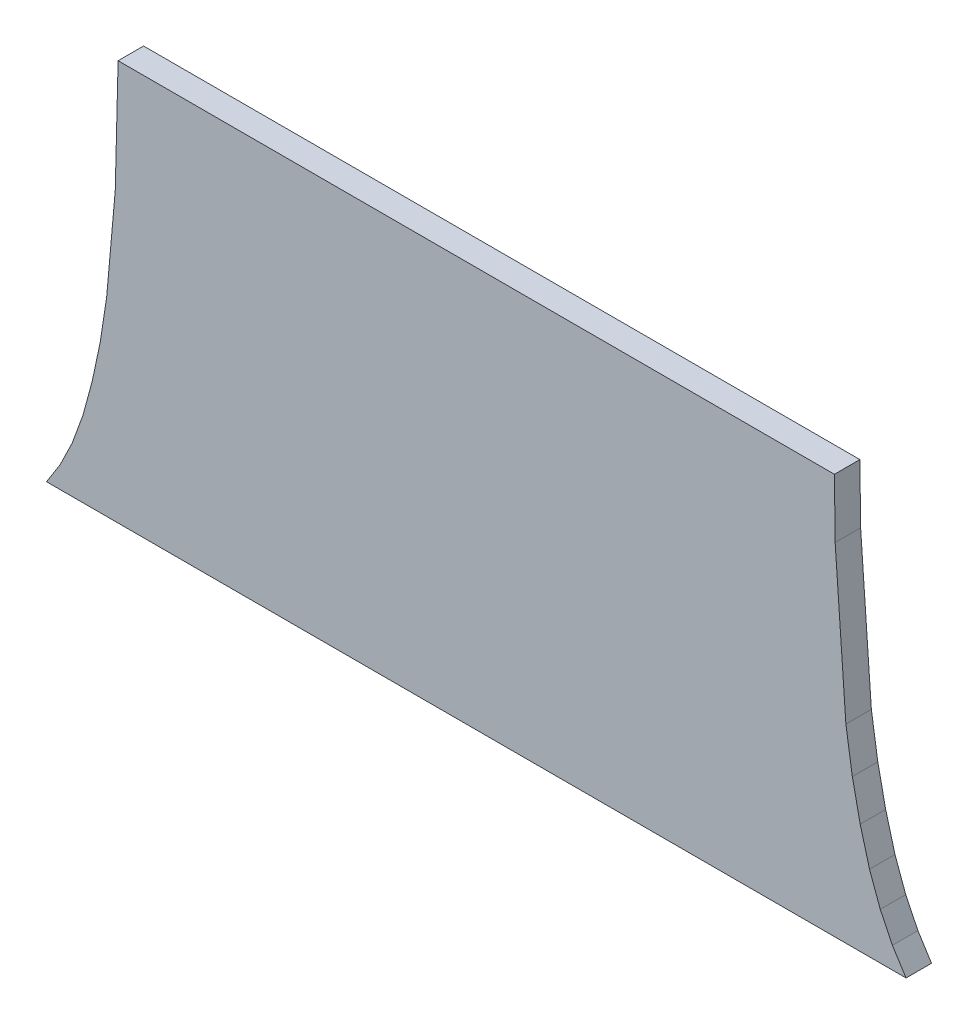
ISO-10303-21;
HEADER;
FILE_DESCRIPTION(('STEP AP214'),'2;1');
FILE_NAME('part.step','',(''),(''),'','','');
FILE_SCHEMA(('AUTOMOTIVE_DESIGN { 1 0 10303 214 1 1 1 1 }'));
ENDSEC;
DATA;
#1=APPLICATION_CONTEXT('core data for automotive mechanical design processes');
#2=APPLICATION_PROTOCOL_DEFINITION('international standard','automotive_design',2000,#1);
#3=PRODUCT_CONTEXT('',#1,'mechanical');
#4=PRODUCT('Part','Part','',(#3));
#5=PRODUCT_RELATED_PRODUCT_CATEGORY('part','',(#4));
#6=PRODUCT_DEFINITION_FORMATION('','',#4);
#7=PRODUCT_DEFINITION_CONTEXT('part definition',#1,'design');
#8=PRODUCT_DEFINITION('design','',#6,#7);
#9=PRODUCT_DEFINITION_SHAPE('','',#8);
#10=(LENGTH_UNIT() NAMED_UNIT(*) SI_UNIT(.MILLI.,.METRE.));
#11=(NAMED_UNIT(*) PLANE_ANGLE_UNIT() SI_UNIT($,.RADIAN.));
#12=(NAMED_UNIT(*) SI_UNIT($,.STERADIAN.) SOLID_ANGLE_UNIT());
#13=UNCERTAINTY_MEASURE_WITH_UNIT(LENGTH_MEASURE(1.E-05),#10,'distance_accuracy_value','');
#14=(GEOMETRIC_REPRESENTATION_CONTEXT(3) GLOBAL_UNCERTAINTY_ASSIGNED_CONTEXT((#13)) GLOBAL_UNIT_ASSIGNED_CONTEXT((#10,
#11,#12)) REPRESENTATION_CONTEXT('',''));
#15=CARTESIAN_POINT('',(0.,0.,0.));
#16=DIRECTION('',(0.,0.,1.));
#17=DIRECTION('',(1.,0.,0.));
#18=AXIS2_PLACEMENT_3D('',#15,#16,#17);
#19=CARTESIAN_POINT('',(88.4000015258789,39.4690017700195,0.));
#20=DIRECTION('',(0.,-1.,0.));
#21=DIRECTION('',(-1.,0.,0.));
#22=AXIS2_PLACEMENT_3D('',#19,#20,#21);
#23=PLANE('',#22);
#24=DIRECTION('',(-1.,0.,0.));
#25=VECTOR('',#24,1.);
#26=CARTESIAN_POINT('',(88.4000015258789,39.4690017700195,0.03556));
#27=LINE('',#26,#25);
#28=CARTESIAN_POINT('',(88.4000015258789,39.4690017700195,0.03556));
#29=VERTEX_POINT('',#28);
#30=CARTESIAN_POINT('',(87.4000015258789,39.4690017700195,0.03556));
#31=VERTEX_POINT('',#30);
#32=EDGE_CURVE('E11',#29,#31,#27,.T.);
#33=ORIENTED_EDGE('',*,*,#32,.F.);
#34=DIRECTION('',(0.,0.,1.));
#35=VECTOR('',#34,1.);
#36=CARTESIAN_POINT('',(88.4000015258789,39.4690017700195,0.));
#37=LINE('',#36,#35);
#38=CARTESIAN_POINT('',(88.4000015258789,39.4690017700195,0.));
#39=VERTEX_POINT('',#38);
#40=EDGE_CURVE('E24',#39,#29,#37,.T.);
#41=ORIENTED_EDGE('',*,*,#40,.F.);
#42=DIRECTION('',(-1.,0.,0.));
#43=VECTOR('',#42,1.);
#44=CARTESIAN_POINT('',(88.4000015258789,39.4690017700195,0.));
#45=LINE('',#44,#43);
#46=CARTESIAN_POINT('',(87.4000015258789,39.4690017700195,0.));
#47=VERTEX_POINT('',#46);
#48=EDGE_CURVE('E311',#39,#47,#45,.T.);
#49=ORIENTED_EDGE('',*,*,#48,.T.);
#50=DIRECTION('',(0.,0.,1.));
#51=VECTOR('',#50,1.);
#52=CARTESIAN_POINT('',(87.4000015258789,39.4690017700195,0.));
#53=LINE('',#52,#51);
#54=EDGE_CURVE('E37',#47,#31,#53,.T.);
#55=ORIENTED_EDGE('',*,*,#54,.T.);
#56=EDGE_LOOP('',(#33,#41,#49,#55));
#57=FACE_BOUND('',#56,.T.);
#58=ADVANCED_FACE('F17',(#57),#23,.F.);
#59=CARTESIAN_POINT('',(88.4010009765625,39.3870010375977,0.));
#60=DIRECTION('',(-0.999925730774336,-0.012187408888299,0.));
#61=DIRECTION('',(-0.012187408888299,0.999925730774336,0.));
#62=AXIS2_PLACEMENT_3D('',#59,#60,#61);
#63=PLANE('',#62);
#64=DIRECTION('',(-0.012187408888299,0.999925730774336,0.));
#65=VECTOR('',#64,1.);
#66=CARTESIAN_POINT('',(88.4010009765625,39.3870010375977,0.03556));
#67=LINE('',#66,#65);
#68=CARTESIAN_POINT('',(88.4010009765625,39.3870010375977,0.03556));
#69=VERTEX_POINT('',#68);
#70=EDGE_CURVE('E307',#69,#29,#67,.T.);
#71=ORIENTED_EDGE('',*,*,#70,.F.);
#72=DIRECTION('',(0.,0.,1.));
#73=VECTOR('',#72,1.);
#74=CARTESIAN_POINT('',(88.4010009765625,39.3870010375977,0.));
#75=LINE('',#74,#73);
#76=CARTESIAN_POINT('',(88.4010009765625,39.3870010375977,0.));
#77=VERTEX_POINT('',#76);
#78=EDGE_CURVE('E305',#77,#69,#75,.T.);
#79=ORIENTED_EDGE('',*,*,#78,.F.);
#80=DIRECTION('',(-0.012187408888299,0.999925730774336,0.));
#81=VECTOR('',#80,1.);
#82=CARTESIAN_POINT('',(88.4010009765625,39.3870010375977,0.));
#83=LINE('',#82,#81);
#84=EDGE_CURVE('E303',#77,#39,#83,.T.);
#85=ORIENTED_EDGE('',*,*,#84,.T.);
#86=ORIENTED_EDGE('',*,*,#40,.T.);
#87=EDGE_LOOP('',(#71,#79,#85,#86));
#88=FACE_BOUND('',#87,.T.);
#89=ADVANCED_FACE('F314',(#88),#63,.F.);
#90=CARTESIAN_POINT('',(88.416000366211,39.1749992370605,0.));
#91=DIRECTION('',(-0.997506488728673,-0.0705748180599396,0.));
#92=DIRECTION('',(-0.0705748180599396,0.997506488728673,0.));
#93=AXIS2_PLACEMENT_3D('',#90,#91,#92);
#94=PLANE('',#93);
#95=DIRECTION('',(-0.0705748180599396,0.997506488728673,0.));
#96=VECTOR('',#95,1.);
#97=CARTESIAN_POINT('',(88.4160003662109,39.1749992370605,0.03556));
#98=LINE('',#97,#96);
#99=CARTESIAN_POINT('',(88.4160003662109,39.1749992370605,0.03556));
#100=VERTEX_POINT('',#99);
#101=EDGE_CURVE('E300',#100,#69,#98,.T.);
#102=ORIENTED_EDGE('',*,*,#101,.F.);
#103=DIRECTION('',(0.,0.,1.));
#104=VECTOR('',#103,1.);
#105=CARTESIAN_POINT('',(88.4160003662109,39.1749992370605,0.));
#106=LINE('',#105,#104);
#107=CARTESIAN_POINT('',(88.4160003662109,39.1749992370605,0.));
#108=VERTEX_POINT('',#107);
#109=EDGE_CURVE('E298',#108,#100,#106,.T.);
#110=ORIENTED_EDGE('',*,*,#109,.F.);
#111=DIRECTION('',(-0.0705748180599396,0.997506488728673,0.));
#112=VECTOR('',#111,1.);
#113=CARTESIAN_POINT('',(88.4160003662109,39.1749992370605,0.));
#114=LINE('',#113,#112);
#115=EDGE_CURVE('E295',#108,#77,#114,.T.);
#116=ORIENTED_EDGE('',*,*,#115,.T.);
#117=ORIENTED_EDGE('',*,*,#78,.T.);
#118=EDGE_LOOP('',(#102,#110,#116,#117));
#119=FACE_BOUND('',#118,.T.);
#120=ADVANCED_FACE('F317',(#119),#94,.F.);
#121=CARTESIAN_POINT('',(88.4250030517578,39.1160011291504,0.));
#122=DIRECTION('',(-0.98855716875994,-0.150846690694003,0.));
#123=DIRECTION('',(-0.150846690694003,0.98855716875994,0.));
#124=AXIS2_PLACEMENT_3D('',#121,#122,#123);
#125=PLANE('',#124);
#126=DIRECTION('',(-0.150846690694003,0.98855716875994,0.));
#127=VECTOR('',#126,1.);
#128=CARTESIAN_POINT('',(88.4250030517578,39.1160011291504,0.03556));
#129=LINE('',#128,#127);
#130=CARTESIAN_POINT('',(88.4250030517578,39.1160011291504,0.03556));
#131=VERTEX_POINT('',#130);
#132=EDGE_CURVE('E292',#131,#100,#129,.T.);
#133=ORIENTED_EDGE('',*,*,#132,.F.);
#134=DIRECTION('',(0.,0.,1.));
#135=VECTOR('',#134,1.);
#136=CARTESIAN_POINT('',(88.4250030517578,39.1160011291504,0.));
#137=LINE('',#136,#135);
#138=CARTESIAN_POINT('',(88.4250030517578,39.1160011291504,0.));
#139=VERTEX_POINT('',#138);
#140=EDGE_CURVE('E290',#139,#131,#137,.T.);
#141=ORIENTED_EDGE('',*,*,#140,.F.);
#142=DIRECTION('',(-0.150846690694003,0.98855716875994,0.));
#143=VECTOR('',#142,1.);
#144=CARTESIAN_POINT('',(88.4250030517578,39.1160011291504,0.));
#145=LINE('',#144,#143);
#146=EDGE_CURVE('E287',#139,#108,#145,.T.);
#147=ORIENTED_EDGE('',*,*,#146,.T.);
#148=ORIENTED_EDGE('',*,*,#109,.T.);
#149=EDGE_LOOP('',(#133,#141,#147,#148));
#150=FACE_BOUND('',#149,.T.);
#151=ADVANCED_FACE('F322',(#150),#125,.F.);
#152=CARTESIAN_POINT('',(88.4359970092774,39.0639991760254,0.));
#153=DIRECTION('',(-0.978374288693552,-0.206842334214702,0.));
#154=DIRECTION('',(-0.206842334214702,0.978374288693552,0.));
#155=AXIS2_PLACEMENT_3D('',#152,#153,#154);
#156=PLANE('',#155);
#157=DIRECTION('',(-0.206842334214702,0.978374288693552,0.));
#158=VECTOR('',#157,1.);
#159=CARTESIAN_POINT('',(88.4359970092774,39.0639991760254,0.03556));
#160=LINE('',#159,#158);
#161=CARTESIAN_POINT('',(88.4359970092774,39.0639991760254,0.03556));
#162=VERTEX_POINT('',#161);
#163=EDGE_CURVE('E284',#162,#131,#160,.T.);
#164=ORIENTED_EDGE('',*,*,#163,.F.);
#165=DIRECTION('',(0.,0.,1.));
#166=VECTOR('',#165,1.);
#167=CARTESIAN_POINT('',(88.4359970092774,39.0639991760254,0.));
#168=LINE('',#167,#166);
#169=CARTESIAN_POINT('',(88.4359970092774,39.0639991760254,0.));
#170=VERTEX_POINT('',#169);
#171=EDGE_CURVE('E282',#170,#162,#168,.T.);
#172=ORIENTED_EDGE('',*,*,#171,.F.);
#173=DIRECTION('',(-0.206842334214702,0.978374288693552,0.));
#174=VECTOR('',#173,1.);
#175=CARTESIAN_POINT('',(88.4359970092774,39.0639991760254,0.));
#176=LINE('',#175,#174);
#177=EDGE_CURVE('E279',#170,#139,#176,.T.);
#178=ORIENTED_EDGE('',*,*,#177,.T.);
#179=ORIENTED_EDGE('',*,*,#140,.T.);
#180=EDGE_LOOP('',(#164,#172,#178,#179));
#181=FACE_BOUND('',#180,.T.);
#182=ADVANCED_FACE('F325',(#181),#156,.F.);
#183=CARTESIAN_POINT('',(88.4489974975586,39.015998840332,0.));
#184=DIRECTION('',(-0.965224355692604,-0.26142292014626,0.));
#185=DIRECTION('',(-0.26142292014626,0.965224355692604,0.));
#186=AXIS2_PLACEMENT_3D('',#183,#184,#185);
#187=PLANE('',#186);
#188=DIRECTION('',(-0.26142292014626,0.965224355692604,0.));
#189=VECTOR('',#188,1.);
#190=CARTESIAN_POINT('',(88.4489974975586,39.015998840332,0.03556));
#191=LINE('',#190,#189);
#192=CARTESIAN_POINT('',(88.4489974975586,39.015998840332,0.03556));
#193=VERTEX_POINT('',#192);
#194=EDGE_CURVE('E276',#193,#162,#191,.T.);
#195=ORIENTED_EDGE('',*,*,#194,.F.);
#196=DIRECTION('',(0.,0.,1.));
#197=VECTOR('',#196,1.);
#198=CARTESIAN_POINT('',(88.4489974975586,39.015998840332,0.));
#199=LINE('',#198,#197);
#200=CARTESIAN_POINT('',(88.4489974975586,39.015998840332,0.));
#201=VERTEX_POINT('',#200);
#202=EDGE_CURVE('E274',#201,#193,#199,.T.);
#203=ORIENTED_EDGE('',*,*,#202,.F.);
#204=DIRECTION('',(-0.26142292014626,0.965224355692604,0.));
#205=VECTOR('',#204,1.);
#206=CARTESIAN_POINT('',(88.4489974975586,39.015998840332,0.));
#207=LINE('',#206,#205);
#208=EDGE_CURVE('E271',#201,#170,#207,.T.);
#209=ORIENTED_EDGE('',*,*,#208,.T.);
#210=ORIENTED_EDGE('',*,*,#171,.T.);
#211=EDGE_LOOP('',(#195,#203,#209,#210));
#212=FACE_BOUND('',#211,.T.);
#213=ADVANCED_FACE('F330',(#212),#187,.F.);
#214=CARTESIAN_POINT('',(88.463996887207,38.9749984741211,0.));
#215=DIRECTION('',(-0.939128353177272,-0.343566494668128,0.));
#216=DIRECTION('',(-0.343566494668128,0.939128353177272,0.));
#217=AXIS2_PLACEMENT_3D('',#214,#215,#216);
#218=PLANE('',#217);
#219=DIRECTION('',(-0.343566494668128,0.939128353177272,0.));
#220=VECTOR('',#219,1.);
#221=CARTESIAN_POINT('',(88.463996887207,38.9749984741211,0.03556));
#222=LINE('',#221,#220);
#223=CARTESIAN_POINT('',(88.463996887207,38.9749984741211,0.03556));
#224=VERTEX_POINT('',#223);
#225=EDGE_CURVE('E268',#224,#193,#222,.T.);
#226=ORIENTED_EDGE('',*,*,#225,.F.);
#227=DIRECTION('',(0.,0.,1.));
#228=VECTOR('',#227,1.);
#229=CARTESIAN_POINT('',(88.463996887207,38.9749984741211,0.));
#230=LINE('',#229,#228);
#231=CARTESIAN_POINT('',(88.463996887207,38.9749984741211,0.));
#232=VERTEX_POINT('',#231);
#233=EDGE_CURVE('E266',#232,#224,#230,.T.);
#234=ORIENTED_EDGE('',*,*,#233,.F.);
#235=DIRECTION('',(-0.343566494668128,0.939128353177272,0.));
#236=VECTOR('',#235,1.);
#237=CARTESIAN_POINT('',(88.463996887207,38.9749984741211,0.));
#238=LINE('',#237,#236);
#239=EDGE_CURVE('E263',#232,#201,#238,.T.);
#240=ORIENTED_EDGE('',*,*,#239,.T.);
#241=ORIENTED_EDGE('',*,*,#202,.T.);
#242=EDGE_LOOP('',(#226,#234,#240,#241));
#243=FACE_BOUND('',#242,.T.);
#244=ADVANCED_FACE('F333',(#243),#218,.F.);
#245=CARTESIAN_POINT('',(88.4810028076172,38.939998626709,0.));
#246=DIRECTION('',(-0.899447608111395,-0.437028603483444,0.));
#247=DIRECTION('',(-0.437028603483444,0.899447608111395,0.));
#248=AXIS2_PLACEMENT_3D('',#245,#246,#247);
#249=PLANE('',#248);
#250=DIRECTION('',(-0.437028603483444,0.899447608111395,0.));
#251=VECTOR('',#250,1.);
#252=CARTESIAN_POINT('',(88.4810028076172,38.939998626709,0.03556));
#253=LINE('',#252,#251);
#254=CARTESIAN_POINT('',(88.4810028076172,38.939998626709,0.03556));
#255=VERTEX_POINT('',#254);
#256=EDGE_CURVE('E260',#255,#224,#253,.T.);
#257=ORIENTED_EDGE('',*,*,#256,.F.);
#258=DIRECTION('',(0.,0.,1.));
#259=VECTOR('',#258,1.);
#260=CARTESIAN_POINT('',(88.4810028076172,38.939998626709,0.));
#261=LINE('',#260,#259);
#262=CARTESIAN_POINT('',(88.4810028076172,38.939998626709,0.));
#263=VERTEX_POINT('',#262);
#264=EDGE_CURVE('E258',#263,#255,#261,.T.);
#265=ORIENTED_EDGE('',*,*,#264,.F.);
#266=DIRECTION('',(-0.437028603483444,0.899447608111395,0.));
#267=VECTOR('',#266,1.);
#268=CARTESIAN_POINT('',(88.4810028076172,38.939998626709,0.));
#269=LINE('',#268,#267);
#270=EDGE_CURVE('E255',#263,#232,#269,.T.);
#271=ORIENTED_EDGE('',*,*,#270,.T.);
#272=ORIENTED_EDGE('',*,*,#233,.T.);
#273=EDGE_LOOP('',(#257,#265,#271,#272));
#274=FACE_BOUND('',#273,.T.);
#275=ADVANCED_FACE('F338',(#274),#249,.F.);
#276=CARTESIAN_POINT('',(88.5,38.9099998474121,0.));
#277=DIRECTION('',(-0.844844974102474,-0.535011186550142,0.));
#278=DIRECTION('',(-0.535011186550142,0.844844974102474,0.));
#279=AXIS2_PLACEMENT_3D('',#276,#277,#278);
#280=PLANE('',#279);
#281=DIRECTION('',(-0.535011186550142,0.844844974102474,0.));
#282=VECTOR('',#281,1.);
#283=CARTESIAN_POINT('',(88.5,38.9099998474121,0.03556));
#284=LINE('',#283,#282);
#285=CARTESIAN_POINT('',(88.5,38.9099998474121,0.03556));
#286=VERTEX_POINT('',#285);
#287=EDGE_CURVE('E252',#286,#255,#284,.T.);
#288=ORIENTED_EDGE('',*,*,#287,.F.);
#289=DIRECTION('',(0.,0.,1.));
#290=VECTOR('',#289,1.);
#291=CARTESIAN_POINT('',(88.5,38.9099998474121,0.));
#292=LINE('',#291,#290);
#293=CARTESIAN_POINT('',(88.5,38.9099998474121,0.));
#294=VERTEX_POINT('',#293);
#295=EDGE_CURVE('E250',#294,#286,#292,.T.);
#296=ORIENTED_EDGE('',*,*,#295,.F.);
#297=DIRECTION('',(-0.535011186550142,0.844844974102474,0.));
#298=VECTOR('',#297,1.);
#299=CARTESIAN_POINT('',(88.5,38.9099998474121,0.));
#300=LINE('',#299,#298);
#301=EDGE_CURVE('E247',#294,#263,#300,.T.);
#302=ORIENTED_EDGE('',*,*,#301,.T.);
#303=ORIENTED_EDGE('',*,*,#264,.T.);
#304=EDGE_LOOP('',(#288,#296,#302,#303));
#305=FACE_BOUND('',#304,.T.);
#306=ADVANCED_FACE('F341',(#305),#280,.F.);
#307=CARTESIAN_POINT('',(87.9041210945304,38.9099998474121,0.));
#308=DIRECTION('',(0.,1.,0.));
#309=DIRECTION('',(1.,0.,0.));
#310=AXIS2_PLACEMENT_3D('',#307,#308,#309);
#311=PLANE('',#310);
#312=DIRECTION('',(1.,0.,0.));
#313=VECTOR('',#312,1.);
#314=CARTESIAN_POINT('',(87.3000030517578,38.9099998474121,0.03556));
#315=LINE('',#314,#313);
#316=CARTESIAN_POINT('',(87.9041210945304,38.9099998474121,0.03556));
#317=VERTEX_POINT('',#316);
#318=EDGE_CURVE('E244',#317,#286,#315,.T.);
#319=ORIENTED_EDGE('',*,*,#318,.F.);
#320=DIRECTION('',(0.,0.,1.));
#321=VECTOR('',#320,1.);
#322=CARTESIAN_POINT('',(87.9041210945304,38.9099998474121,0.));
#323=LINE('',#322,#321);
#324=CARTESIAN_POINT('',(87.9041210945304,38.9099998474121,0.));
#325=VERTEX_POINT('',#324);
#326=EDGE_CURVE('E242',#325,#317,#323,.T.);
#327=ORIENTED_EDGE('',*,*,#326,.F.);
#328=DIRECTION('',(1.,0.,0.));
#329=VECTOR('',#328,1.);
#330=CARTESIAN_POINT('',(87.3000030517578,38.9099998474121,0.));
#331=LINE('',#330,#329);
#332=EDGE_CURVE('E239',#325,#294,#331,.T.);
#333=ORIENTED_EDGE('',*,*,#332,.T.);
#334=ORIENTED_EDGE('',*,*,#295,.T.);
#335=EDGE_LOOP('',(#319,#327,#333,#334));
#336=FACE_BOUND('',#335,.T.);
#337=ADVANCED_FACE('F346',(#336),#311,.F.);
#338=CARTESIAN_POINT('',(87.900002,38.4600196,0.));
#339=DIRECTION('',(0.,0.,-1.));
#340=DIRECTION('',(1.,0.,0.));
#341=AXIS2_PLACEMENT_3D('',#338,#339,#340);
#342=CYLINDRICAL_SURFACE('',#341,0.4499991);
#343=ORIENTED_EDGE('',*,*,#326,.T.);
#344=CARTESIAN_POINT('',(87.900002,38.4600196,0.03556));
#345=DIRECTION('',(0.,0.,1.));
#346=DIRECTION('',(1.,0.,0.));
#347=AXIS2_PLACEMENT_3D('',#344,#345,#346);
#348=CIRCLE('',#347,0.4499991);
#349=CARTESIAN_POINT('',(87.8958829054695,38.9099998474121,0.03556));
#350=VERTEX_POINT('',#349);
#351=EDGE_CURVE('E236',#317,#350,#348,.T.);
#352=ORIENTED_EDGE('',*,*,#351,.T.);
#353=DIRECTION('',(0.,0.,1.));
#354=VECTOR('',#353,1.);
#355=CARTESIAN_POINT('',(87.8958829054695,38.9099998474121,0.));
#356=LINE('',#355,#354);
#357=CARTESIAN_POINT('',(87.8958829054695,38.9099998474121,0.));
#358=VERTEX_POINT('',#357);
#359=EDGE_CURVE('E234',#358,#350,#356,.T.);
#360=ORIENTED_EDGE('',*,*,#359,.F.);
#361=CARTESIAN_POINT('',(87.900002,38.4600196,0.));
#362=DIRECTION('',(0.,0.,1.));
#363=DIRECTION('',(1.,0.,0.));
#364=AXIS2_PLACEMENT_3D('',#361,#362,#363);
#365=CIRCLE('',#364,0.4499991);
#366=EDGE_CURVE('E231',#325,#358,#365,.T.);
#367=ORIENTED_EDGE('',*,*,#366,.F.);
#368=EDGE_LOOP('',(#343,#352,#360,#367));
#369=FACE_BOUND('',#368,.T.);
#370=ADVANCED_FACE('F349',(#369),#342,.F.);
#371=CARTESIAN_POINT('',(87.3000030517578,38.9099998474121,0.));
#372=DIRECTION('',(0.,1.,0.));
#373=DIRECTION('',(1.,0.,0.));
#374=AXIS2_PLACEMENT_3D('',#371,#372,#373);
#375=PLANE('',#374);
#376=DIRECTION('',(1.,0.,0.));
#377=VECTOR('',#376,1.);
#378=CARTESIAN_POINT('',(87.3000030517578,38.9099998474121,0.03556));
#379=LINE('',#378,#377);
#380=CARTESIAN_POINT('',(87.3000030517578,38.9099998474121,0.03556));
#381=VERTEX_POINT('',#380);
#382=EDGE_CURVE('E228',#381,#350,#379,.T.);
#383=ORIENTED_EDGE('',*,*,#382,.F.);
#384=DIRECTION('',(0.,0.,1.));
#385=VECTOR('',#384,1.);
#386=CARTESIAN_POINT('',(87.3000030517578,38.9099998474121,0.));
#387=LINE('',#386,#385);
#388=CARTESIAN_POINT('',(87.3000030517578,38.9099998474121,0.));
#389=VERTEX_POINT('',#388);
#390=EDGE_CURVE('E226',#389,#381,#387,.T.);
#391=ORIENTED_EDGE('',*,*,#390,.F.);
#392=EDGE_CURVE('E225',#389,#358,#331,.T.);
#393=ORIENTED_EDGE('',*,*,#392,.T.);
#394=ORIENTED_EDGE('',*,*,#359,.T.);
#395=EDGE_LOOP('',(#383,#391,#393,#394));
#396=FACE_BOUND('',#395,.T.);
#397=ADVANCED_FACE('F355',(#396),#375,.F.);
#398=CARTESIAN_POINT('',(87.3190002441406,38.939998626709,0.));
#399=DIRECTION('',(0.844844974102474,-0.535011186550142,0.));
#400=DIRECTION('',(-0.535011186550142,-0.844844974102474,0.));
#401=AXIS2_PLACEMENT_3D('',#398,#399,#400);
#402=PLANE('',#401);
#403=DIRECTION('',(-0.535011186550142,-0.844844974102474,0.));
#404=VECTOR('',#403,1.);
#405=CARTESIAN_POINT('',(87.3190002441406,38.939998626709,0.03556));
#406=LINE('',#405,#404);
#407=CARTESIAN_POINT('',(87.3190002441406,38.939998626709,0.03556));
#408=VERTEX_POINT('',#407);
#409=EDGE_CURVE('E222',#408,#381,#406,.T.);
#410=ORIENTED_EDGE('',*,*,#409,.F.);
#411=DIRECTION('',(0.,0.,1.));
#412=VECTOR('',#411,1.);
#413=CARTESIAN_POINT('',(87.3190002441406,38.939998626709,0.));
#414=LINE('',#413,#412);
#415=CARTESIAN_POINT('',(87.3190002441406,38.939998626709,0.));
#416=VERTEX_POINT('',#415);
#417=EDGE_CURVE('E220',#416,#408,#414,.T.);
#418=ORIENTED_EDGE('',*,*,#417,.F.);
#419=DIRECTION('',(-0.535011186550142,-0.844844974102474,0.));
#420=VECTOR('',#419,1.);
#421=CARTESIAN_POINT('',(87.3190002441406,38.939998626709,0.));
#422=LINE('',#421,#420);
#423=EDGE_CURVE('E217',#416,#389,#422,.T.);
#424=ORIENTED_EDGE('',*,*,#423,.T.);
#425=ORIENTED_EDGE('',*,*,#390,.T.);
#426=EDGE_LOOP('',(#410,#418,#424,#425));
#427=FACE_BOUND('',#426,.T.);
#428=ADVANCED_FACE('F358',(#427),#402,.F.);
#429=CARTESIAN_POINT('',(87.3359985351562,38.9749984741211,0.));
#430=DIRECTION('',(0.89952467075599,-0.43686996543746,0.));
#431=DIRECTION('',(-0.43686996543746,-0.89952467075599,0.));
#432=AXIS2_PLACEMENT_3D('',#429,#430,#431);
#433=PLANE('',#432);
#434=DIRECTION('',(-0.43686996543746,-0.89952467075599,0.));
#435=VECTOR('',#434,1.);
#436=CARTESIAN_POINT('',(87.3359985351562,38.9749984741211,0.03556));
#437=LINE('',#436,#435);
#438=CARTESIAN_POINT('',(87.3359985351562,38.9749984741211,0.03556));
#439=VERTEX_POINT('',#438);
#440=EDGE_CURVE('E214',#439,#408,#437,.T.);
#441=ORIENTED_EDGE('',*,*,#440,.F.);
#442=DIRECTION('',(0.,0.,1.));
#443=VECTOR('',#442,1.);
#444=CARTESIAN_POINT('',(87.3359985351562,38.9749984741211,0.));
#445=LINE('',#444,#443);
#446=CARTESIAN_POINT('',(87.3359985351562,38.9749984741211,0.));
#447=VERTEX_POINT('',#446);
#448=EDGE_CURVE('E212',#447,#439,#445,.T.);
#449=ORIENTED_EDGE('',*,*,#448,.F.);
#450=DIRECTION('',(-0.43686996543746,-0.89952467075599,0.));
#451=VECTOR('',#450,1.);
#452=CARTESIAN_POINT('',(87.3359985351562,38.9749984741211,0.));
#453=LINE('',#452,#451);
#454=EDGE_CURVE('E209',#447,#416,#453,.T.);
#455=ORIENTED_EDGE('',*,*,#454,.T.);
#456=ORIENTED_EDGE('',*,*,#417,.T.);
#457=EDGE_LOOP('',(#441,#449,#455,#456));
#458=FACE_BOUND('',#457,.T.);
#459=ADVANCED_FACE('F363',(#458),#433,.F.);
#460=CARTESIAN_POINT('',(87.3509979248047,39.015998840332,0.));
#461=DIRECTION('',(0.939128353177272,-0.343566494668128,0.));
#462=DIRECTION('',(-0.343566494668128,-0.939128353177272,0.));
#463=AXIS2_PLACEMENT_3D('',#460,#461,#462);
#464=PLANE('',#463);
#465=DIRECTION('',(-0.343566494668128,-0.939128353177272,0.));
#466=VECTOR('',#465,1.);
#467=CARTESIAN_POINT('',(87.3509979248047,39.015998840332,0.03556));
#468=LINE('',#467,#466);
#469=CARTESIAN_POINT('',(87.3509979248047,39.015998840332,0.03556));
#470=VERTEX_POINT('',#469);
#471=EDGE_CURVE('E206',#470,#439,#468,.T.);
#472=ORIENTED_EDGE('',*,*,#471,.F.);
#473=DIRECTION('',(0.,0.,1.));
#474=VECTOR('',#473,1.);
#475=CARTESIAN_POINT('',(87.3509979248047,39.015998840332,0.));
#476=LINE('',#475,#474);
#477=CARTESIAN_POINT('',(87.3509979248047,39.015998840332,0.));
#478=VERTEX_POINT('',#477);
#479=EDGE_CURVE('E204',#478,#470,#476,.T.);
#480=ORIENTED_EDGE('',*,*,#479,.F.);
#481=DIRECTION('',(-0.343566494668128,-0.939128353177272,0.));
#482=VECTOR('',#481,1.);
#483=CARTESIAN_POINT('',(87.3509979248047,39.015998840332,0.));
#484=LINE('',#483,#482);
#485=EDGE_CURVE('E201',#478,#447,#484,.T.);
#486=ORIENTED_EDGE('',*,*,#485,.T.);
#487=ORIENTED_EDGE('',*,*,#448,.T.);
#488=EDGE_LOOP('',(#472,#480,#486,#487));
#489=FACE_BOUND('',#488,.T.);
#490=ADVANCED_FACE('F366',(#489),#464,.F.);
#491=CARTESIAN_POINT('',(87.3639984130859,39.0639991760254,0.));
#492=DIRECTION('',(0.965224355692604,-0.26142292014626,0.));
#493=DIRECTION('',(-0.26142292014626,-0.965224355692604,0.));
#494=AXIS2_PLACEMENT_3D('',#491,#492,#493);
#495=PLANE('',#494);
#496=DIRECTION('',(-0.26142292014626,-0.965224355692604,0.));
#497=VECTOR('',#496,1.);
#498=CARTESIAN_POINT('',(87.3639984130859,39.0639991760254,0.03556));
#499=LINE('',#498,#497);
#500=CARTESIAN_POINT('',(87.3639984130859,39.0639991760254,0.03556));
#501=VERTEX_POINT('',#500);
#502=EDGE_CURVE('E198',#501,#470,#499,.T.);
#503=ORIENTED_EDGE('',*,*,#502,.F.);
#504=DIRECTION('',(0.,0.,1.));
#505=VECTOR('',#504,1.);
#506=CARTESIAN_POINT('',(87.3639984130859,39.0639991760254,0.));
#507=LINE('',#506,#505);
#508=CARTESIAN_POINT('',(87.3639984130859,39.0639991760254,0.));
#509=VERTEX_POINT('',#508);
#510=EDGE_CURVE('E196',#509,#501,#507,.T.);
#511=ORIENTED_EDGE('',*,*,#510,.F.);
#512=DIRECTION('',(-0.26142292014626,-0.965224355692604,0.));
#513=VECTOR('',#512,1.);
#514=CARTESIAN_POINT('',(87.3639984130859,39.0639991760254,0.));
#515=LINE('',#514,#513);
#516=EDGE_CURVE('E193',#509,#478,#515,.T.);
#517=ORIENTED_EDGE('',*,*,#516,.T.);
#518=ORIENTED_EDGE('',*,*,#479,.T.);
#519=EDGE_LOOP('',(#503,#511,#517,#518));
#520=FACE_BOUND('',#519,.T.);
#521=ADVANCED_FACE('F370',(#520),#495,.F.);
#522=CARTESIAN_POINT('',(87.375,39.1160011291504,0.));
#523=DIRECTION('',(0.978345231663085,-0.206979727708065,0.));
#524=DIRECTION('',(-0.206979727708065,-0.978345231663085,0.));
#525=AXIS2_PLACEMENT_3D('',#522,#523,#524);
#526=PLANE('',#525);
#527=DIRECTION('',(-0.206979727708065,-0.978345231663085,0.));
#528=VECTOR('',#527,1.);
#529=CARTESIAN_POINT('',(87.375,39.1160011291504,0.03556));
#530=LINE('',#529,#528);
#531=CARTESIAN_POINT('',(87.375,39.1160011291504,0.03556));
#532=VERTEX_POINT('',#531);
#533=EDGE_CURVE('E190',#532,#501,#530,.T.);
#534=ORIENTED_EDGE('',*,*,#533,.F.);
#535=DIRECTION('',(0.,0.,1.));
#536=VECTOR('',#535,1.);
#537=CARTESIAN_POINT('',(87.375,39.1160011291504,0.));
#538=LINE('',#537,#536);
#539=CARTESIAN_POINT('',(87.375,39.1160011291504,0.));
#540=VERTEX_POINT('',#539);
#541=EDGE_CURVE('E188',#540,#532,#538,.T.);
#542=ORIENTED_EDGE('',*,*,#541,.F.);
#543=DIRECTION('',(-0.206979727708065,-0.978345231663085,0.));
#544=VECTOR('',#543,1.);
#545=CARTESIAN_POINT('',(87.375,39.1160011291504,0.));
#546=LINE('',#545,#544);
#547=EDGE_CURVE('E185',#540,#509,#546,.T.);
#548=ORIENTED_EDGE('',*,*,#547,.T.);
#549=ORIENTED_EDGE('',*,*,#510,.T.);
#550=EDGE_LOOP('',(#534,#542,#548,#549));
#551=FACE_BOUND('',#550,.T.);
#552=ADVANCED_FACE('F373',(#551),#526,.F.);
#553=CARTESIAN_POINT('',(87.3840026855469,39.1749992370605,0.));
#554=DIRECTION('',(0.98855716875994,-0.150846690694003,0.));
#555=DIRECTION('',(-0.150846690694003,-0.98855716875994,0.));
#556=AXIS2_PLACEMENT_3D('',#553,#554,#555);
#557=PLANE('',#556);
#558=DIRECTION('',(-0.150846690694003,-0.98855716875994,0.));
#559=VECTOR('',#558,1.);
#560=CARTESIAN_POINT('',(87.3840026855469,39.1749992370605,0.03556));
#561=LINE('',#560,#559);
#562=CARTESIAN_POINT('',(87.3840026855469,39.1749992370605,0.03556));
#563=VERTEX_POINT('',#562);
#564=EDGE_CURVE('E182',#563,#532,#561,.T.);
#565=ORIENTED_EDGE('',*,*,#564,.F.);
#566=DIRECTION('',(0.,0.,1.));
#567=VECTOR('',#566,1.);
#568=CARTESIAN_POINT('',(87.3840026855469,39.1749992370605,0.));
#569=LINE('',#568,#567);
#570=CARTESIAN_POINT('',(87.3840026855469,39.1749992370605,0.));
#571=VERTEX_POINT('',#570);
#572=EDGE_CURVE('E180',#571,#563,#569,.T.);
#573=ORIENTED_EDGE('',*,*,#572,.F.);
#574=DIRECTION('',(-0.150846690694003,-0.98855716875994,0.));
#575=VECTOR('',#574,1.);
#576=CARTESIAN_POINT('',(87.3840026855469,39.1749992370605,0.));
#577=LINE('',#576,#575);
#578=EDGE_CURVE('E171',#571,#540,#577,.T.);
#579=ORIENTED_EDGE('',*,*,#578,.T.);
#580=ORIENTED_EDGE('',*,*,#541,.T.);
#581=EDGE_LOOP('',(#565,#573,#579,#580));
#582=FACE_BOUND('',#581,.T.);
#583=ADVANCED_FACE('F376',(#582),#557,.F.);
#584=CARTESIAN_POINT('',(87.3960037231445,39.310001373291,0.));
#585=DIRECTION('',(0.996072089069625,-0.0885459958240475,0.));
#586=DIRECTION('',(-0.0885459958240475,-0.996072089069625,0.));
#587=AXIS2_PLACEMENT_3D('',#584,#585,#586);
#588=PLANE('',#587);
#589=DIRECTION('',(-0.0885459958240475,-0.996072089069625,0.));
#590=VECTOR('',#589,1.);
#591=CARTESIAN_POINT('',(87.3960037231445,39.310001373291,0.03556));
#592=LINE('',#591,#590);
#593=CARTESIAN_POINT('',(87.3960037231445,39.310001373291,0.03556));
#594=VERTEX_POINT('',#593);
#595=EDGE_CURVE('E157',#594,#563,#592,.T.);
#596=ORIENTED_EDGE('',*,*,#595,.F.);
#597=DIRECTION('',(0.,0.,1.));
#598=VECTOR('',#597,1.);
#599=CARTESIAN_POINT('',(87.3960037231445,39.310001373291,0.));
#600=LINE('',#599,#598);
#601=CARTESIAN_POINT('',(87.3960037231445,39.310001373291,0.));
#602=VERTEX_POINT('',#601);
#603=EDGE_CURVE('E152',#602,#594,#600,.T.);
#604=ORIENTED_EDGE('',*,*,#603,.F.);
#605=DIRECTION('',(-0.0885459958240475,-0.996072089069625,0.));
#606=VECTOR('',#605,1.);
#607=CARTESIAN_POINT('',(87.3960037231445,39.310001373291,0.));
#608=LINE('',#607,#606);
#609=EDGE_CURVE('E155',#602,#571,#608,.T.);
#610=ORIENTED_EDGE('',*,*,#609,.T.);
#611=ORIENTED_EDGE('',*,*,#572,.T.);
#612=EDGE_LOOP('',(#596,#604,#610,#611));
#613=FACE_BOUND('',#612,.T.);
#614=ADVANCED_FACE('F154',(#613),#588,.F.);
#615=CARTESIAN_POINT('',(87.4000015258789,39.4690017700195,0.));
#616=DIRECTION('',(0.999684055752358,-0.0251354067903474,0.));
#617=DIRECTION('',(-0.0251354067903474,-0.999684055752358,0.));
#618=AXIS2_PLACEMENT_3D('',#615,#616,#617);
#619=PLANE('',#618);
#620=DIRECTION('',(-0.0251354067903474,-0.999684055752358,0.));
#621=VECTOR('',#620,1.);
#622=CARTESIAN_POINT('',(87.4000015258789,39.4690017700195,0.03556));
#623=LINE('',#622,#621);
#624=EDGE_CURVE('E172',#31,#594,#623,.T.);
#625=ORIENTED_EDGE('',*,*,#624,.F.);
#626=ORIENTED_EDGE('',*,*,#54,.F.);
#627=DIRECTION('',(-0.0251354067903474,-0.999684055752358,0.));
#628=VECTOR('',#627,1.);
#629=CARTESIAN_POINT('',(87.4000015258789,39.4690017700195,0.));
#630=LINE('',#629,#628);
#631=EDGE_CURVE('E168',#47,#602,#630,.T.);
#632=ORIENTED_EDGE('',*,*,#631,.T.);
#633=ORIENTED_EDGE('',*,*,#603,.T.);
#634=EDGE_LOOP('',(#625,#626,#632,#633));
#635=FACE_BOUND('',#634,.T.);
#636=ADVANCED_FACE('F174',(#635),#619,.F.);
#637=CARTESIAN_POINT('',(87.4000015258789,39.4690017700195,0.));
#638=DIRECTION('',(0.,0.,1.));
#639=DIRECTION('',(1.,0.,0.));
#640=AXIS2_PLACEMENT_3D('',#637,#638,#639);
#641=PLANE('',#640);
#642=ORIENTED_EDGE('',*,*,#631,.F.);
#643=ORIENTED_EDGE('',*,*,#48,.F.);
#644=ORIENTED_EDGE('',*,*,#84,.F.);
#645=ORIENTED_EDGE('',*,*,#115,.F.);
#646=ORIENTED_EDGE('',*,*,#146,.F.);
#647=ORIENTED_EDGE('',*,*,#177,.F.);
#648=ORIENTED_EDGE('',*,*,#208,.F.);
#649=ORIENTED_EDGE('',*,*,#239,.F.);
#650=ORIENTED_EDGE('',*,*,#270,.F.);
#651=ORIENTED_EDGE('',*,*,#301,.F.);
#652=ORIENTED_EDGE('',*,*,#332,.F.);
#653=ORIENTED_EDGE('',*,*,#366,.T.);
#654=ORIENTED_EDGE('',*,*,#392,.F.);
#655=ORIENTED_EDGE('',*,*,#423,.F.);
#656=ORIENTED_EDGE('',*,*,#454,.F.);
#657=ORIENTED_EDGE('',*,*,#485,.F.);
#658=ORIENTED_EDGE('',*,*,#516,.F.);
#659=ORIENTED_EDGE('',*,*,#547,.F.);
#660=ORIENTED_EDGE('',*,*,#578,.F.);
#661=ORIENTED_EDGE('',*,*,#609,.F.);
#662=EDGE_LOOP('',(#642,#643,#644,#645,#646,#647,#648,#649,#650,#651,#652,#653,#654,#655,#656,
#657,#658,#659,#660,#661));
#663=FACE_BOUND('',#662,.T.);
#664=ADVANCED_FACE('F166',(#663),#641,.F.);
#665=CARTESIAN_POINT('',(87.4000015258789,39.4690017700195,0.03556));
#666=DIRECTION('',(0.,0.,1.));
#667=DIRECTION('',(1.,0.,0.));
#668=AXIS2_PLACEMENT_3D('',#665,#666,#667);
#669=PLANE('',#668);
#670=ORIENTED_EDGE('',*,*,#32,.T.);
#671=ORIENTED_EDGE('',*,*,#624,.T.);
#672=ORIENTED_EDGE('',*,*,#595,.T.);
#673=ORIENTED_EDGE('',*,*,#564,.T.);
#674=ORIENTED_EDGE('',*,*,#533,.T.);
#675=ORIENTED_EDGE('',*,*,#502,.T.);
#676=ORIENTED_EDGE('',*,*,#471,.T.);
#677=ORIENTED_EDGE('',*,*,#440,.T.);
#678=ORIENTED_EDGE('',*,*,#409,.T.);
#679=ORIENTED_EDGE('',*,*,#382,.T.);
#680=ORIENTED_EDGE('',*,*,#351,.F.);
#681=ORIENTED_EDGE('',*,*,#318,.T.);
#682=ORIENTED_EDGE('',*,*,#287,.T.);
#683=ORIENTED_EDGE('',*,*,#256,.T.);
#684=ORIENTED_EDGE('',*,*,#225,.T.);
#685=ORIENTED_EDGE('',*,*,#194,.T.);
#686=ORIENTED_EDGE('',*,*,#163,.T.);
#687=ORIENTED_EDGE('',*,*,#132,.T.);
#688=ORIENTED_EDGE('',*,*,#101,.T.);
#689=ORIENTED_EDGE('',*,*,#70,.T.);
#690=EDGE_LOOP('',(#670,#671,#672,#673,#674,#675,#676,#677,#678,#679,#680,#681,#682,#683,#684,
#685,#686,#687,#688,#689));
#691=FACE_BOUND('',#690,.T.);
#692=ADVANCED_FACE('F378',(#691),#669,.T.);
#693=CLOSED_SHELL('',(#58,#89,#120,#151,#182,#213,#244,#275,#306,#337,#370,#397,#428,#459,#490,
#521,#552,#583,#614,#636,#664,#692));
#694=MANIFOLD_SOLID_BREP('B1',#693);
#695=ADVANCED_BREP_SHAPE_REPRESENTATION('',(#18,#694),#14);
#696=SHAPE_DEFINITION_REPRESENTATION(#9,#695);
ENDSEC;
END-ISO-10303-21;
